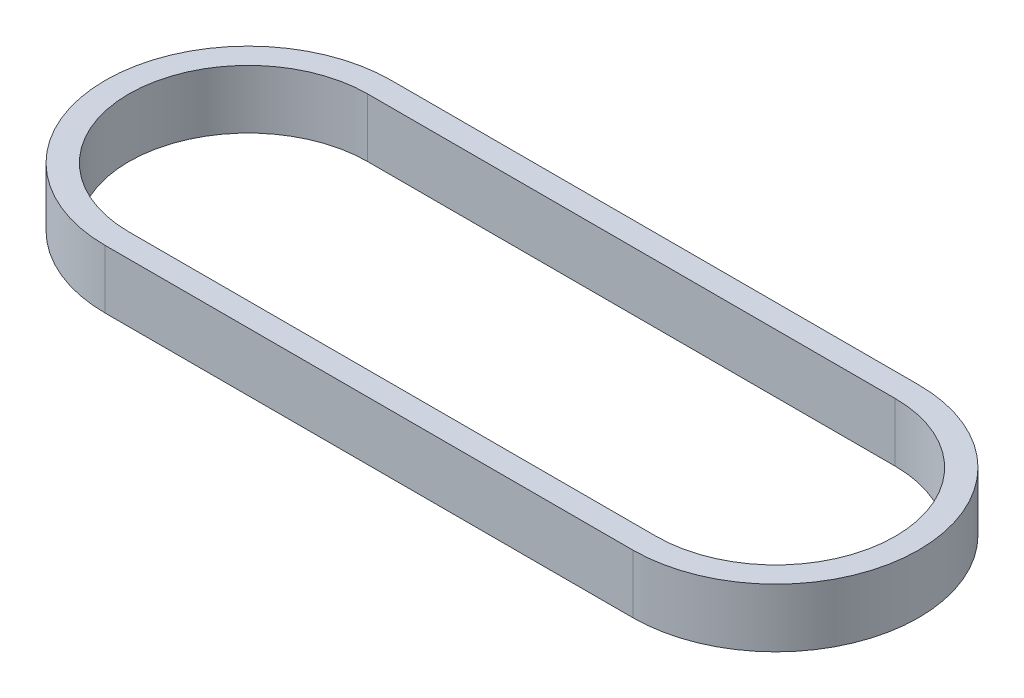
ISO-10303-21;
HEADER;
FILE_DESCRIPTION(('STEP AP214'),'2;1');
FILE_NAME('part.step','',(''),(''),'','','');
FILE_SCHEMA(('AUTOMOTIVE_DESIGN { 1 0 10303 214 1 1 1 1 }'));
ENDSEC;
DATA;
#1=APPLICATION_CONTEXT('core data for automotive mechanical design processes');
#2=APPLICATION_PROTOCOL_DEFINITION('international standard','automotive_design',2000,#1);
#3=PRODUCT_CONTEXT('',#1,'mechanical');
#4=PRODUCT('Part','Part','',(#3));
#5=PRODUCT_RELATED_PRODUCT_CATEGORY('part','',(#4));
#6=PRODUCT_DEFINITION_FORMATION('','',#4);
#7=PRODUCT_DEFINITION_CONTEXT('part definition',#1,'design');
#8=PRODUCT_DEFINITION('design','',#6,#7);
#9=PRODUCT_DEFINITION_SHAPE('','',#8);
#10=(LENGTH_UNIT() NAMED_UNIT(*) SI_UNIT(.MILLI.,.METRE.));
#11=(NAMED_UNIT(*) PLANE_ANGLE_UNIT() SI_UNIT($,.RADIAN.));
#12=(NAMED_UNIT(*) SI_UNIT($,.STERADIAN.) SOLID_ANGLE_UNIT());
#13=UNCERTAINTY_MEASURE_WITH_UNIT(LENGTH_MEASURE(1.E-05),#10,'distance_accuracy_value','');
#14=(GEOMETRIC_REPRESENTATION_CONTEXT(3) GLOBAL_UNCERTAINTY_ASSIGNED_CONTEXT((#13)) GLOBAL_UNIT_ASSIGNED_CONTEXT((#10,
#11,#12)) REPRESENTATION_CONTEXT('',''));
#15=CARTESIAN_POINT('',(0.,0.,0.));
#16=DIRECTION('',(0.,0.,1.));
#17=DIRECTION('',(1.,0.,0.));
#18=AXIS2_PLACEMENT_3D('',#15,#16,#17);
#19=CARTESIAN_POINT('',(-27.000000864,3.,12.2260156475277));
#20=DIRECTION('',(0.,0.,-1.));
#21=DIRECTION('',(0.,-1.,0.));
#22=AXIS2_PLACEMENT_3D('',#19,#20,#21);
#23=PLANE('',#22);
#24=DIRECTION('',(1.,0.,0.));
#25=VECTOR('',#24,1.);
#26=CARTESIAN_POINT('',(-27.000000864,-3.,12.2260156475277));
#27=LINE('',#26,#25);
#28=CARTESIAN_POINT('',(-27.000000864,-3.,12.2260156475277));
#29=VERTEX_POINT('',#28);
#30=CARTESIAN_POINT('',(27.000000864,-3.,12.2260156475277));
#31=VERTEX_POINT('',#30);
#32=EDGE_CURVE('E113',#29,#31,#27,.T.);
#33=ORIENTED_EDGE('',*,*,#32,.F.);
#34=DIRECTION('',(0.,-1.,0.));
#35=VECTOR('',#34,1.);
#36=CARTESIAN_POINT('',(-27.000000864,3.,12.2260156475277));
#37=LINE('',#36,#35);
#38=CARTESIAN_POINT('',(-27.000000864,3.,12.2260156475277));
#39=VERTEX_POINT('',#38);
#40=EDGE_CURVE('E11',#39,#29,#37,.T.);
#41=ORIENTED_EDGE('',*,*,#40,.F.);
#42=DIRECTION('',(1.,0.,0.));
#43=VECTOR('',#42,1.);
#44=CARTESIAN_POINT('',(-27.000000864,3.,12.2260156475277));
#45=LINE('',#44,#43);
#46=CARTESIAN_POINT('',(27.000000864,3.,12.2260156475277));
#47=VERTEX_POINT('',#46);
#48=EDGE_CURVE('E116',#39,#47,#45,.T.);
#49=ORIENTED_EDGE('',*,*,#48,.T.);
#50=DIRECTION('',(0.,-1.,0.));
#51=VECTOR('',#50,1.);
#52=CARTESIAN_POINT('',(27.000000864,3.,12.2260156475277));
#53=LINE('',#52,#51);
#54=EDGE_CURVE('E111',#47,#31,#53,.T.);
#55=ORIENTED_EDGE('',*,*,#54,.T.);
#56=EDGE_LOOP('',(#33,#41,#49,#55));
#57=FACE_BOUND('',#56,.T.);
#58=ADVANCED_FACE('F16',(#57),#23,.T.);
#59=CARTESIAN_POINT('',(-27.000000864,3.,0.));
#60=DIRECTION('',(0.,-1.,0.));
#61=DIRECTION('',(0.,0.,-1.));
#62=AXIS2_PLACEMENT_3D('',#59,#60,#61);
#63=CYLINDRICAL_SURFACE('',#62,12.2260156475277);
#64=CARTESIAN_POINT('',(-27.000000864,-3.,0.));
#65=DIRECTION('',(0.,1.,0.));
#66=DIRECTION('',(0.,0.,1.));
#67=AXIS2_PLACEMENT_3D('',#64,#65,#66);
#68=CIRCLE('',#67,12.2260156475277);
#69=CARTESIAN_POINT('',(-27.000000864,-3.,-12.2260156475277));
#70=VERTEX_POINT('',#69);
#71=EDGE_CURVE('E130',#70,#29,#68,.T.);
#72=ORIENTED_EDGE('',*,*,#71,.F.);
#73=DIRECTION('',(0.,-1.,0.));
#74=VECTOR('',#73,1.);
#75=CARTESIAN_POINT('',(-27.000000864,3.,-12.2260156475277));
#76=LINE('',#75,#74);
#77=CARTESIAN_POINT('',(-27.000000864,3.,-12.2260156475277));
#78=VERTEX_POINT('',#77);
#79=EDGE_CURVE('E27',#78,#70,#76,.T.);
#80=ORIENTED_EDGE('',*,*,#79,.F.);
#81=CARTESIAN_POINT('',(-27.000000864,3.,0.));
#82=DIRECTION('',(0.,1.,0.));
#83=DIRECTION('',(0.,0.,1.));
#84=AXIS2_PLACEMENT_3D('',#81,#82,#83);
#85=CIRCLE('',#84,12.2260156475277);
#86=EDGE_CURVE('E157',#78,#39,#85,.T.);
#87=ORIENTED_EDGE('',*,*,#86,.T.);
#88=ORIENTED_EDGE('',*,*,#40,.T.);
#89=EDGE_LOOP('',(#72,#80,#87,#88));
#90=FACE_BOUND('',#89,.T.);
#91=ADVANCED_FACE('F193',(#90),#63,.F.);
#92=CARTESIAN_POINT('',(27.000000864,3.,-12.2260156475277));
#93=DIRECTION('',(0.,0.,1.));
#94=DIRECTION('',(1.,0.,0.));
#95=AXIS2_PLACEMENT_3D('',#92,#93,#94);
#96=PLANE('',#95);
#97=DIRECTION('',(-1.,0.,0.));
#98=VECTOR('',#97,1.);
#99=CARTESIAN_POINT('',(27.000000864,-3.,-12.2260156475277));
#100=LINE('',#99,#98);
#101=CARTESIAN_POINT('',(27.000000864,-3.,-12.2260156475277));
#102=VERTEX_POINT('',#101);
#103=EDGE_CURVE('E137',#102,#70,#100,.T.);
#104=ORIENTED_EDGE('',*,*,#103,.F.);
#105=DIRECTION('',(0.,-1.,0.));
#106=VECTOR('',#105,1.);
#107=CARTESIAN_POINT('',(27.000000864,3.,-12.2260156475277));
#108=LINE('',#107,#106);
#109=CARTESIAN_POINT('',(27.000000864,3.,-12.2260156475277));
#110=VERTEX_POINT('',#109);
#111=EDGE_CURVE('E122',#110,#102,#108,.T.);
#112=ORIENTED_EDGE('',*,*,#111,.F.);
#113=DIRECTION('',(-1.,0.,0.));
#114=VECTOR('',#113,1.);
#115=CARTESIAN_POINT('',(27.000000864,3.,-12.2260156475277));
#116=LINE('',#115,#114);
#117=EDGE_CURVE('E20',#110,#78,#116,.T.);
#118=ORIENTED_EDGE('',*,*,#117,.T.);
#119=ORIENTED_EDGE('',*,*,#79,.T.);
#120=EDGE_LOOP('',(#104,#112,#118,#119));
#121=FACE_BOUND('',#120,.T.);
#122=ADVANCED_FACE('F190',(#121),#96,.T.);
#123=CARTESIAN_POINT('',(27.000000864,3.,0.));
#124=DIRECTION('',(0.,-1.,0.));
#125=DIRECTION('',(0.,0.,-1.));
#126=AXIS2_PLACEMENT_3D('',#123,#124,#125);
#127=CYLINDRICAL_SURFACE('',#126,12.2260156475277);
#128=CARTESIAN_POINT('',(27.000000864,-3.,0.));
#129=DIRECTION('',(0.,1.,0.));
#130=DIRECTION('',(0.,0.,1.));
#131=AXIS2_PLACEMENT_3D('',#128,#129,#130);
#132=CIRCLE('',#131,12.2260156475277);
#133=EDGE_CURVE('E129',#31,#102,#132,.T.);
#134=ORIENTED_EDGE('',*,*,#133,.F.);
#135=ORIENTED_EDGE('',*,*,#54,.F.);
#136=CARTESIAN_POINT('',(27.000000864,3.,0.));
#137=DIRECTION('',(0.,1.,0.));
#138=DIRECTION('',(0.,0.,1.));
#139=AXIS2_PLACEMENT_3D('',#136,#137,#138);
#140=CIRCLE('',#139,12.2260156475277);
#141=EDGE_CURVE('E164',#47,#110,#140,.T.);
#142=ORIENTED_EDGE('',*,*,#141,.T.);
#143=ORIENTED_EDGE('',*,*,#111,.T.);
#144=EDGE_LOOP('',(#134,#135,#142,#143));
#145=FACE_BOUND('',#144,.T.);
#146=ADVANCED_FACE('F134',(#145),#127,.F.);
#147=CARTESIAN_POINT('',(-27.000000864,3.,14.6390156475277));
#148=DIRECTION('',(0.,0.,-1.));
#149=DIRECTION('',(0.,-1.,0.));
#150=AXIS2_PLACEMENT_3D('',#147,#148,#149);
#151=PLANE('',#150);
#152=DIRECTION('',(1.,0.,0.));
#153=VECTOR('',#152,1.);
#154=CARTESIAN_POINT('',(-27.000000864,-3.,14.6390156475277));
#155=LINE('',#154,#153);
#156=CARTESIAN_POINT('',(-27.000000864,-3.,14.6390156475277));
#157=VERTEX_POINT('',#156);
#158=CARTESIAN_POINT('',(27.000000864,-3.,14.6390156475277));
#159=VERTEX_POINT('',#158);
#160=EDGE_CURVE('E156',#157,#159,#155,.T.);
#161=ORIENTED_EDGE('',*,*,#160,.T.);
#162=DIRECTION('',(0.,-1.,0.));
#163=VECTOR('',#162,1.);
#164=CARTESIAN_POINT('',(27.000000864,3.,14.6390156475277));
#165=LINE('',#164,#163);
#166=CARTESIAN_POINT('',(27.000000864,3.,14.6390156475277));
#167=VERTEX_POINT('',#166);
#168=EDGE_CURVE('E167',#167,#159,#165,.T.);
#169=ORIENTED_EDGE('',*,*,#168,.F.);
#170=DIRECTION('',(1.,0.,0.));
#171=VECTOR('',#170,1.);
#172=CARTESIAN_POINT('',(-27.000000864,3.,14.6390156475277));
#173=LINE('',#172,#171);
#174=CARTESIAN_POINT('',(-27.000000864,3.,14.6390156475277));
#175=VERTEX_POINT('',#174);
#176=EDGE_CURVE('E199',#175,#167,#173,.T.);
#177=ORIENTED_EDGE('',*,*,#176,.F.);
#178=DIRECTION('',(0.,-1.,0.));
#179=VECTOR('',#178,1.);
#180=CARTESIAN_POINT('',(-27.000000864,3.,14.6390156475277));
#181=LINE('',#180,#179);
#182=EDGE_CURVE('E78',#175,#157,#181,.T.);
#183=ORIENTED_EDGE('',*,*,#182,.T.);
#184=EDGE_LOOP('',(#161,#169,#177,#183));
#185=FACE_BOUND('',#184,.T.);
#186=ADVANCED_FACE('F217',(#185),#151,.F.);
#187=CARTESIAN_POINT('',(-27.000000864,3.,0.));
#188=DIRECTION('',(0.,-1.,0.));
#189=DIRECTION('',(0.,0.,-1.));
#190=AXIS2_PLACEMENT_3D('',#187,#188,#189);
#191=CYLINDRICAL_SURFACE('',#190,14.6390156475277);
#192=CARTESIAN_POINT('',(-27.000000864,-3.,0.));
#193=DIRECTION('',(0.,1.,0.));
#194=DIRECTION('',(0.,0.,1.));
#195=AXIS2_PLACEMENT_3D('',#192,#193,#194);
#196=CIRCLE('',#195,14.6390156475277);
#197=CARTESIAN_POINT('',(-27.000000864,-3.,-14.6390156475277));
#198=VERTEX_POINT('',#197);
#199=EDGE_CURVE('E146',#198,#157,#196,.T.);
#200=ORIENTED_EDGE('',*,*,#199,.T.);
#201=ORIENTED_EDGE('',*,*,#182,.F.);
#202=CARTESIAN_POINT('',(-27.000000864,3.,0.));
#203=DIRECTION('',(0.,1.,0.));
#204=DIRECTION('',(0.,0.,1.));
#205=AXIS2_PLACEMENT_3D('',#202,#203,#204);
#206=CIRCLE('',#205,14.6390156475277);
#207=CARTESIAN_POINT('',(-27.000000864,3.,-14.6390156475277));
#208=VERTEX_POINT('',#207);
#209=EDGE_CURVE('E150',#208,#175,#206,.T.);
#210=ORIENTED_EDGE('',*,*,#209,.F.);
#211=DIRECTION('',(0.,-1.,0.));
#212=VECTOR('',#211,1.);
#213=CARTESIAN_POINT('',(-27.000000864,3.,-14.6390156475277));
#214=LINE('',#213,#212);
#215=EDGE_CURVE('E94',#208,#198,#214,.T.);
#216=ORIENTED_EDGE('',*,*,#215,.T.);
#217=EDGE_LOOP('',(#200,#201,#210,#216));
#218=FACE_BOUND('',#217,.T.);
#219=ADVANCED_FACE('F18',(#218),#191,.T.);
#220=CARTESIAN_POINT('',(27.000000864,3.,-14.6390156475277));
#221=DIRECTION('',(0.,0.,1.));
#222=DIRECTION('',(1.,0.,0.));
#223=AXIS2_PLACEMENT_3D('',#220,#221,#222);
#224=PLANE('',#223);
#225=DIRECTION('',(-1.,0.,0.));
#226=VECTOR('',#225,1.);
#227=CARTESIAN_POINT('',(27.000000864,-3.,-14.6390156475277));
#228=LINE('',#227,#226);
#229=CARTESIAN_POINT('',(27.000000864,-3.,-14.6390156475277));
#230=VERTEX_POINT('',#229);
#231=EDGE_CURVE('E138',#230,#198,#228,.T.);
#232=ORIENTED_EDGE('',*,*,#231,.T.);
#233=ORIENTED_EDGE('',*,*,#215,.F.);
#234=DIRECTION('',(-1.,0.,0.));
#235=VECTOR('',#234,1.);
#236=CARTESIAN_POINT('',(27.000000864,3.,-14.6390156475277));
#237=LINE('',#236,#235);
#238=CARTESIAN_POINT('',(27.000000864,3.,-14.6390156475277));
#239=VERTEX_POINT('',#238);
#240=EDGE_CURVE('E174',#239,#208,#237,.T.);
#241=ORIENTED_EDGE('',*,*,#240,.F.);
#242=DIRECTION('',(0.,-1.,0.));
#243=VECTOR('',#242,1.);
#244=CARTESIAN_POINT('',(27.000000864,3.,-14.6390156475277));
#245=LINE('',#244,#243);
#246=EDGE_CURVE('E132',#239,#230,#245,.T.);
#247=ORIENTED_EDGE('',*,*,#246,.T.);
#248=EDGE_LOOP('',(#232,#233,#241,#247));
#249=FACE_BOUND('',#248,.T.);
#250=ADVANCED_FACE('F222',(#249),#224,.F.);
#251=CARTESIAN_POINT('',(27.000000864,3.,0.));
#252=DIRECTION('',(0.,-1.,0.));
#253=DIRECTION('',(0.,0.,-1.));
#254=AXIS2_PLACEMENT_3D('',#251,#252,#253);
#255=CYLINDRICAL_SURFACE('',#254,14.6390156475277);
#256=CARTESIAN_POINT('',(27.000000864,-3.,0.));
#257=DIRECTION('',(0.,1.,0.));
#258=DIRECTION('',(0.,0.,1.));
#259=AXIS2_PLACEMENT_3D('',#256,#257,#258);
#260=CIRCLE('',#259,14.6390156475277);
#261=EDGE_CURVE('E152',#159,#230,#260,.T.);
#262=ORIENTED_EDGE('',*,*,#261,.T.);
#263=ORIENTED_EDGE('',*,*,#246,.F.);
#264=CARTESIAN_POINT('',(27.000000864,3.,0.));
#265=DIRECTION('',(0.,1.,0.));
#266=DIRECTION('',(0.,0.,1.));
#267=AXIS2_PLACEMENT_3D('',#264,#265,#266);
#268=CIRCLE('',#267,14.6390156475277);
#269=EDGE_CURVE('E178',#167,#239,#268,.T.);
#270=ORIENTED_EDGE('',*,*,#269,.F.);
#271=ORIENTED_EDGE('',*,*,#168,.T.);
#272=EDGE_LOOP('',(#262,#263,#270,#271));
#273=FACE_BOUND('',#272,.T.);
#274=ADVANCED_FACE('F211',(#273),#255,.T.);
#275=CARTESIAN_POINT('',(27.000000864,-3.,0.));
#276=DIRECTION('',(0.,1.,0.));
#277=DIRECTION('',(1.,0.,0.));
#278=AXIS2_PLACEMENT_3D('',#275,#276,#277);
#279=PLANE('',#278);
#280=ORIENTED_EDGE('',*,*,#133,.T.);
#281=ORIENTED_EDGE('',*,*,#103,.T.);
#282=ORIENTED_EDGE('',*,*,#71,.T.);
#283=ORIENTED_EDGE('',*,*,#32,.T.);
#284=EDGE_LOOP('',(#280,#281,#282,#283));
#285=FACE_BOUND('',#284,.T.);
#286=ORIENTED_EDGE('',*,*,#261,.F.);
#287=ORIENTED_EDGE('',*,*,#160,.F.);
#288=ORIENTED_EDGE('',*,*,#199,.F.);
#289=ORIENTED_EDGE('',*,*,#231,.F.);
#290=EDGE_LOOP('',(#286,#287,#288,#289));
#291=FACE_BOUND('',#290,.T.);
#292=ADVANCED_FACE('F126',(#285,#291),#279,.F.);
#293=CARTESIAN_POINT('',(27.000000864,3.,0.));
#294=DIRECTION('',(0.,1.,0.));
#295=DIRECTION('',(1.,0.,0.));
#296=AXIS2_PLACEMENT_3D('',#293,#294,#295);
#297=PLANE('',#296);
#298=ORIENTED_EDGE('',*,*,#117,.F.);
#299=ORIENTED_EDGE('',*,*,#141,.F.);
#300=ORIENTED_EDGE('',*,*,#48,.F.);
#301=ORIENTED_EDGE('',*,*,#86,.F.);
#302=EDGE_LOOP('',(#298,#299,#300,#301));
#303=FACE_BOUND('',#302,.T.);
#304=ORIENTED_EDGE('',*,*,#269,.T.);
#305=ORIENTED_EDGE('',*,*,#240,.T.);
#306=ORIENTED_EDGE('',*,*,#209,.T.);
#307=ORIENTED_EDGE('',*,*,#176,.T.);
#308=EDGE_LOOP('',(#304,#305,#306,#307));
#309=FACE_BOUND('',#308,.T.);
#310=ADVANCED_FACE('F208',(#303,#309),#297,.T.);
#311=CLOSED_SHELL('',(#58,#91,#122,#146,#186,#219,#250,#274,#292,#310));
#312=MANIFOLD_SOLID_BREP('B1',#311);
#313=ADVANCED_BREP_SHAPE_REPRESENTATION('',(#18,#312),#14);
#314=SHAPE_DEFINITION_REPRESENTATION(#9,#313);
ENDSEC;
END-ISO-10303-21;
